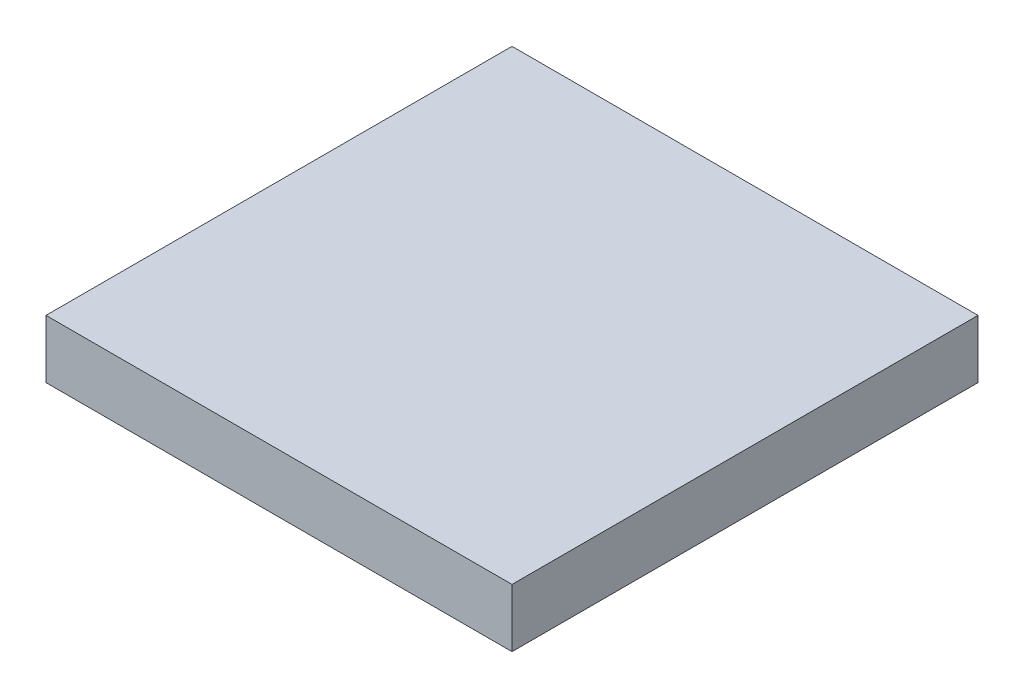
ISO-10303-21;
HEADER;
FILE_DESCRIPTION(('STEP AP214'),'2;1');
FILE_NAME('part.step','',(''),(''),'','','');
FILE_SCHEMA(('AUTOMOTIVE_DESIGN { 1 0 10303 214 1 1 1 1 }'));
ENDSEC;
DATA;
#1=APPLICATION_CONTEXT('core data for automotive mechanical design processes');
#2=APPLICATION_PROTOCOL_DEFINITION('international standard','automotive_design',2000,#1);
#3=PRODUCT_CONTEXT('',#1,'mechanical');
#4=PRODUCT('Part','Part','',(#3));
#5=PRODUCT_RELATED_PRODUCT_CATEGORY('part','',(#4));
#6=PRODUCT_DEFINITION_FORMATION('','',#4);
#7=PRODUCT_DEFINITION_CONTEXT('part definition',#1,'design');
#8=PRODUCT_DEFINITION('design','',#6,#7);
#9=PRODUCT_DEFINITION_SHAPE('','',#8);
#10=(LENGTH_UNIT() NAMED_UNIT(*) SI_UNIT(.MILLI.,.METRE.));
#11=(NAMED_UNIT(*) PLANE_ANGLE_UNIT() SI_UNIT($,.RADIAN.));
#12=(NAMED_UNIT(*) SI_UNIT($,.STERADIAN.) SOLID_ANGLE_UNIT());
#13=UNCERTAINTY_MEASURE_WITH_UNIT(LENGTH_MEASURE(1.E-05),#10,'distance_accuracy_value','');
#14=(GEOMETRIC_REPRESENTATION_CONTEXT(3) GLOBAL_UNCERTAINTY_ASSIGNED_CONTEXT((#13)) GLOBAL_UNIT_ASSIGNED_CONTEXT((#10,
#11,#12)) REPRESENTATION_CONTEXT('',''));
#15=CARTESIAN_POINT('',(0.,0.,0.));
#16=DIRECTION('',(0.,0.,1.));
#17=DIRECTION('',(1.,0.,0.));
#18=AXIS2_PLACEMENT_3D('',#15,#16,#17);
#19=CARTESIAN_POINT('',(0.,1.5875,0.));
#20=DIRECTION('',(1.,0.,0.));
#21=DIRECTION('',(0.,0.,-1.));
#22=AXIS2_PLACEMENT_3D('',#19,#20,#21);
#23=PLANE('',#22);
#24=DIRECTION('',(0.,0.,1.));
#25=VECTOR('',#24,1.);
#26=CARTESIAN_POINT('',(0.,0.,0.));
#27=LINE('',#26,#25);
#28=CARTESIAN_POINT('',(0.,0.,-12.7));
#29=VERTEX_POINT('',#28);
#30=CARTESIAN_POINT('',(0.,0.,0.));
#31=VERTEX_POINT('',#30);
#32=EDGE_CURVE('E96',#29,#31,#27,.T.);
#33=ORIENTED_EDGE('',*,*,#32,.T.);
#34=DIRECTION('',(0.,-1.,0.));
#35=VECTOR('',#34,1.);
#36=CARTESIAN_POINT('',(0.,1.5875,0.));
#37=LINE('',#36,#35);
#38=CARTESIAN_POINT('',(0.,1.5875,0.));
#39=VERTEX_POINT('',#38);
#40=EDGE_CURVE('E11',#39,#31,#37,.T.);
#41=ORIENTED_EDGE('',*,*,#40,.F.);
#42=DIRECTION('',(0.,0.,1.));
#43=VECTOR('',#42,1.);
#44=CARTESIAN_POINT('',(0.,1.5875,0.));
#45=LINE('',#44,#43);
#46=CARTESIAN_POINT('',(0.,1.5875,-12.7));
#47=VERTEX_POINT('',#46);
#48=EDGE_CURVE('E84',#47,#39,#45,.T.);
#49=ORIENTED_EDGE('',*,*,#48,.F.);
#50=DIRECTION('',(0.,-1.,0.));
#51=VECTOR('',#50,1.);
#52=CARTESIAN_POINT('',(0.,1.5875,-12.7));
#53=LINE('',#52,#51);
#54=EDGE_CURVE('E92',#47,#29,#53,.T.);
#55=ORIENTED_EDGE('',*,*,#54,.T.);
#56=EDGE_LOOP('',(#33,#41,#49,#55));
#57=FACE_BOUND('',#56,.T.);
#58=ADVANCED_FACE('F33',(#57),#23,.F.);
#59=CARTESIAN_POINT('',(0.,1.5875,0.));
#60=DIRECTION('',(0.,0.,-1.));
#61=DIRECTION('',(-1.,0.,0.));
#62=AXIS2_PLACEMENT_3D('',#59,#60,#61);
#63=PLANE('',#62);
#64=DIRECTION('',(1.,0.,0.));
#65=VECTOR('',#64,1.);
#66=CARTESIAN_POINT('',(0.,0.,0.));
#67=LINE('',#66,#65);
#68=CARTESIAN_POINT('',(12.7,0.,0.));
#69=VERTEX_POINT('',#68);
#70=EDGE_CURVE('E88',#31,#69,#67,.T.);
#71=ORIENTED_EDGE('',*,*,#70,.T.);
#72=DIRECTION('',(0.,-1.,0.));
#73=VECTOR('',#72,1.);
#74=CARTESIAN_POINT('',(12.7,1.5875,0.));
#75=LINE('',#74,#73);
#76=CARTESIAN_POINT('',(12.7,1.5875,0.));
#77=VERTEX_POINT('',#76);
#78=EDGE_CURVE('E41',#77,#69,#75,.T.);
#79=ORIENTED_EDGE('',*,*,#78,.F.);
#80=DIRECTION('',(1.,0.,0.));
#81=VECTOR('',#80,1.);
#82=CARTESIAN_POINT('',(0.,1.5875,0.));
#83=LINE('',#82,#81);
#84=EDGE_CURVE('E79',#39,#77,#83,.T.);
#85=ORIENTED_EDGE('',*,*,#84,.F.);
#86=ORIENTED_EDGE('',*,*,#40,.T.);
#87=EDGE_LOOP('',(#71,#79,#85,#86));
#88=FACE_BOUND('',#87,.T.);
#89=ADVANCED_FACE('F87',(#88),#63,.F.);
#90=CARTESIAN_POINT('',(12.7,1.5875,0.));
#91=DIRECTION('',(-1.,0.,0.));
#92=DIRECTION('',(0.,0.,1.));
#93=AXIS2_PLACEMENT_3D('',#90,#91,#92);
#94=PLANE('',#93);
#95=DIRECTION('',(0.,0.,-1.));
#96=VECTOR('',#95,1.);
#97=CARTESIAN_POINT('',(12.7,0.,0.));
#98=LINE('',#97,#96);
#99=CARTESIAN_POINT('',(12.7,0.,-12.7));
#100=VERTEX_POINT('',#99);
#101=EDGE_CURVE('E66',#69,#100,#98,.T.);
#102=ORIENTED_EDGE('',*,*,#101,.T.);
#103=DIRECTION('',(0.,-1.,0.));
#104=VECTOR('',#103,1.);
#105=CARTESIAN_POINT('',(12.7,1.5875,-12.7));
#106=LINE('',#105,#104);
#107=CARTESIAN_POINT('',(12.7,1.5875,-12.7));
#108=VERTEX_POINT('',#107);
#109=EDGE_CURVE('E89',#108,#100,#106,.T.);
#110=ORIENTED_EDGE('',*,*,#109,.F.);
#111=DIRECTION('',(0.,0.,-1.));
#112=VECTOR('',#111,1.);
#113=CARTESIAN_POINT('',(12.7,1.5875,0.));
#114=LINE('',#113,#112);
#115=EDGE_CURVE('E82',#77,#108,#114,.T.);
#116=ORIENTED_EDGE('',*,*,#115,.F.);
#117=ORIENTED_EDGE('',*,*,#78,.T.);
#118=EDGE_LOOP('',(#102,#110,#116,#117));
#119=FACE_BOUND('',#118,.T.);
#120=ADVANCED_FACE('F90',(#119),#94,.F.);
#121=CARTESIAN_POINT('',(0.,1.5875,-12.7));
#122=DIRECTION('',(0.,0.,1.));
#123=DIRECTION('',(1.,0.,0.));
#124=AXIS2_PLACEMENT_3D('',#121,#122,#123);
#125=PLANE('',#124);
#126=DIRECTION('',(-1.,0.,0.));
#127=VECTOR('',#126,1.);
#128=CARTESIAN_POINT('',(0.,0.,-12.7));
#129=LINE('',#128,#127);
#130=EDGE_CURVE('E72',#100,#29,#129,.T.);
#131=ORIENTED_EDGE('',*,*,#130,.T.);
#132=ORIENTED_EDGE('',*,*,#54,.F.);
#133=DIRECTION('',(-1.,0.,0.));
#134=VECTOR('',#133,1.);
#135=CARTESIAN_POINT('',(0.,1.5875,-12.7));
#136=LINE('',#135,#134);
#137=EDGE_CURVE('E49',#108,#47,#136,.T.);
#138=ORIENTED_EDGE('',*,*,#137,.F.);
#139=ORIENTED_EDGE('',*,*,#109,.T.);
#140=EDGE_LOOP('',(#131,#132,#138,#139));
#141=FACE_BOUND('',#140,.T.);
#142=ADVANCED_FACE('F103',(#141),#125,.F.);
#143=CARTESIAN_POINT('',(0.,1.5875,0.));
#144=DIRECTION('',(0.,-1.,0.));
#145=DIRECTION('',(0.,0.,-1.));
#146=AXIS2_PLACEMENT_3D('',#143,#144,#145);
#147=PLANE('',#146);
#148=ORIENTED_EDGE('',*,*,#48,.T.);
#149=ORIENTED_EDGE('',*,*,#84,.T.);
#150=ORIENTED_EDGE('',*,*,#115,.T.);
#151=ORIENTED_EDGE('',*,*,#137,.T.);
#152=EDGE_LOOP('',(#148,#149,#150,#151));
#153=FACE_BOUND('',#152,.T.);
#154=ADVANCED_FACE('F80',(#153),#147,.F.);
#155=CARTESIAN_POINT('',(0.,0.,0.));
#156=DIRECTION('',(0.,-1.,0.));
#157=DIRECTION('',(0.,0.,-1.));
#158=AXIS2_PLACEMENT_3D('',#155,#156,#157);
#159=PLANE('',#158);
#160=ORIENTED_EDGE('',*,*,#32,.F.);
#161=ORIENTED_EDGE('',*,*,#130,.F.);
#162=ORIENTED_EDGE('',*,*,#101,.F.);
#163=ORIENTED_EDGE('',*,*,#70,.F.);
#164=EDGE_LOOP('',(#160,#161,#162,#163));
#165=FACE_BOUND('',#164,.T.);
#166=ADVANCED_FACE('F106',(#165),#159,.T.);
#167=CLOSED_SHELL('',(#58,#89,#120,#142,#154,#166));
#168=MANIFOLD_SOLID_BREP('B2',#167);
#169=ADVANCED_BREP_SHAPE_REPRESENTATION('',(#18,#168),#14);
#170=SHAPE_DEFINITION_REPRESENTATION(#9,#169);
ENDSEC;
END-ISO-10303-21;
